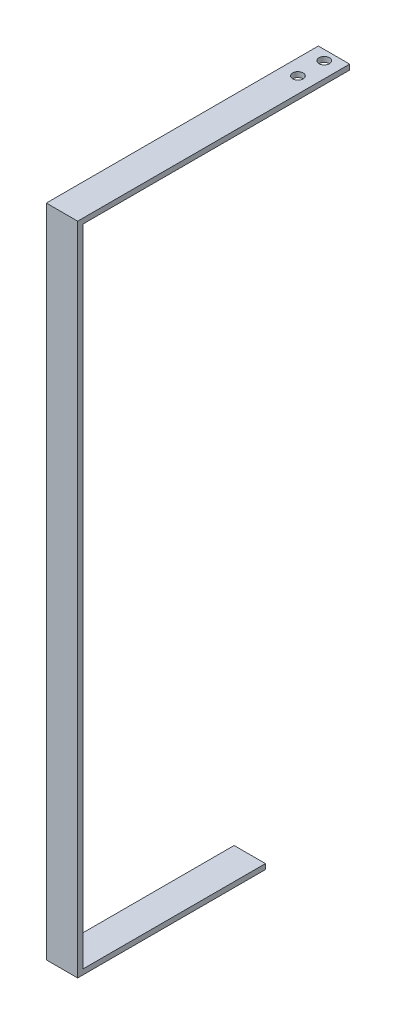
ISO-10303-21;
HEADER;
FILE_DESCRIPTION(('STEP AP214'),'2;1');
FILE_NAME('part.step','',(''),(''),'','','');
FILE_SCHEMA(('AUTOMOTIVE_DESIGN { 1 0 10303 214 1 1 1 1 }'));
ENDSEC;
DATA;
#1=APPLICATION_CONTEXT('core data for automotive mechanical design processes');
#2=APPLICATION_PROTOCOL_DEFINITION('international standard','automotive_design',2000,#1);
#3=PRODUCT_CONTEXT('',#1,'mechanical');
#4=PRODUCT('Part','Part','',(#3));
#5=PRODUCT_RELATED_PRODUCT_CATEGORY('part','',(#4));
#6=PRODUCT_DEFINITION_FORMATION('','',#4);
#7=PRODUCT_DEFINITION_CONTEXT('part definition',#1,'design');
#8=PRODUCT_DEFINITION('design','',#6,#7);
#9=PRODUCT_DEFINITION_SHAPE('','',#8);
#10=(LENGTH_UNIT() NAMED_UNIT(*) SI_UNIT(.MILLI.,.METRE.));
#11=(NAMED_UNIT(*) PLANE_ANGLE_UNIT() SI_UNIT($,.RADIAN.));
#12=(NAMED_UNIT(*) SI_UNIT($,.STERADIAN.) SOLID_ANGLE_UNIT());
#13=UNCERTAINTY_MEASURE_WITH_UNIT(LENGTH_MEASURE(1.E-05),#10,'distance_accuracy_value','');
#14=(GEOMETRIC_REPRESENTATION_CONTEXT(3) GLOBAL_UNCERTAINTY_ASSIGNED_CONTEXT((#13)) GLOBAL_UNIT_ASSIGNED_CONTEXT((#10,
#11,#12)) REPRESENTATION_CONTEXT('',''));
#15=CARTESIAN_POINT('',(0.,0.,0.));
#16=DIRECTION('',(0.,0.,1.));
#17=DIRECTION('',(1.,0.,0.));
#18=AXIS2_PLACEMENT_3D('',#15,#16,#17);
#19=CARTESIAN_POINT('',(19.0499999999999,793.705,222.));
#20=DIRECTION('',(0.,0.,1.));
#21=DIRECTION('',(1.,0.,0.));
#22=AXIS2_PLACEMENT_3D('',#19,#20,#21);
#23=PLANE('',#22);
#24=DIRECTION('',(-1.,0.,0.));
#25=VECTOR('',#24,1.);
#26=CARTESIAN_POINT('',(-19.0500000000001,787.395,222.));
#27=LINE('',#26,#25);
#28=CARTESIAN_POINT('',(19.0499999999999,787.395,222.));
#29=VERTEX_POINT('',#28);
#30=CARTESIAN_POINT('',(-19.0500000000001,787.395,222.));
#31=VERTEX_POINT('',#30);
#32=EDGE_CURVE('E165',#29,#31,#27,.T.);
#33=ORIENTED_EDGE('',*,*,#32,.F.);
#34=DIRECTION('',(0.,-1.,0.));
#35=VECTOR('',#34,1.);
#36=CARTESIAN_POINT('',(19.0499999999999,793.705,222.));
#37=LINE('',#36,#35);
#38=CARTESIAN_POINT('',(19.05,3.155,222.));
#39=VERTEX_POINT('',#38);
#40=EDGE_CURVE('E51',#29,#39,#37,.T.);
#41=ORIENTED_EDGE('',*,*,#40,.T.);
#42=DIRECTION('',(-1.,0.,0.));
#43=VECTOR('',#42,1.);
#44=CARTESIAN_POINT('',(19.05,3.155,222.));
#45=LINE('',#44,#43);
#46=CARTESIAN_POINT('',(-19.05,3.155,222.));
#47=VERTEX_POINT('',#46);
#48=EDGE_CURVE('E141',#39,#47,#45,.T.);
#49=ORIENTED_EDGE('',*,*,#48,.T.);
#50=DIRECTION('',(0.,-1.,0.));
#51=VECTOR('',#50,1.);
#52=CARTESIAN_POINT('',(-19.0500000000001,793.705,222.));
#53=LINE('',#52,#51);
#54=EDGE_CURVE('E88',#31,#47,#53,.T.);
#55=ORIENTED_EDGE('',*,*,#54,.F.);
#56=EDGE_LOOP('',(#33,#41,#49,#55));
#57=FACE_BOUND('',#56,.T.);
#58=ADVANCED_FACE('F36',(#57),#23,.F.);
#59=CARTESIAN_POINT('',(19.05,3.155,228.31));
#60=DIRECTION('',(0.,-1.,0.));
#61=DIRECTION('',(1.,0.,0.));
#62=AXIS2_PLACEMENT_3D('',#59,#60,#61);
#63=PLANE('',#62);
#64=ORIENTED_EDGE('',*,*,#48,.F.);
#65=DIRECTION('',(0.,0.,-1.));
#66=VECTOR('',#65,1.);
#67=CARTESIAN_POINT('',(19.05,3.155,228.31));
#68=LINE('',#67,#66);
#69=CARTESIAN_POINT('',(19.05,3.155,0.));
#70=VERTEX_POINT('',#69);
#71=EDGE_CURVE('E90',#39,#70,#68,.T.);
#72=ORIENTED_EDGE('',*,*,#71,.T.);
#73=DIRECTION('',(-1.,0.,0.));
#74=VECTOR('',#73,1.);
#75=CARTESIAN_POINT('',(19.05,3.155,0.));
#76=LINE('',#75,#74);
#77=CARTESIAN_POINT('',(-19.05,3.155,0.));
#78=VERTEX_POINT('',#77);
#79=EDGE_CURVE('E94',#70,#78,#76,.T.);
#80=ORIENTED_EDGE('',*,*,#79,.T.);
#81=DIRECTION('',(0.,0.,-1.));
#82=VECTOR('',#81,1.);
#83=CARTESIAN_POINT('',(-19.05,3.155,228.31));
#84=LINE('',#83,#82);
#85=EDGE_CURVE('E80',#47,#78,#84,.T.);
#86=ORIENTED_EDGE('',*,*,#85,.F.);
#87=EDGE_LOOP('',(#64,#72,#80,#86));
#88=FACE_BOUND('',#87,.T.);
#89=ADVANCED_FACE('F95',(#88),#63,.F.);
#90=CARTESIAN_POINT('',(-19.05,-3.155,228.31));
#91=DIRECTION('',(1.,0.,0.));
#92=DIRECTION('',(0.,0.,-1.));
#93=AXIS2_PLACEMENT_3D('',#90,#91,#92);
#94=PLANE('',#93);
#95=DIRECTION('',(0.,-1.,0.));
#96=VECTOR('',#95,1.);
#97=CARTESIAN_POINT('',(-19.05,-3.155,0.));
#98=LINE('',#97,#96);
#99=CARTESIAN_POINT('',(-19.05,-3.155,0.));
#100=VERTEX_POINT('',#99);
#101=EDGE_CURVE('E84',#78,#100,#98,.T.);
#102=ORIENTED_EDGE('',*,*,#101,.T.);
#103=DIRECTION('',(0.,0.,-1.));
#104=VECTOR('',#103,1.);
#105=CARTESIAN_POINT('',(-19.05,-3.155,228.31));
#106=LINE('',#105,#104);
#107=CARTESIAN_POINT('',(-19.05,-3.155,228.31));
#108=VERTEX_POINT('',#107);
#109=EDGE_CURVE('E11',#108,#100,#106,.T.);
#110=ORIENTED_EDGE('',*,*,#109,.F.);
#111=DIRECTION('',(0.,-1.,0.));
#112=VECTOR('',#111,1.);
#113=CARTESIAN_POINT('',(-19.05,-3.155,228.31));
#114=LINE('',#113,#112);
#115=CARTESIAN_POINT('',(-19.0500000000001,793.705,228.31));
#116=VERTEX_POINT('',#115);
#117=EDGE_CURVE('E100',#116,#108,#114,.T.);
#118=ORIENTED_EDGE('',*,*,#117,.F.);
#119=DIRECTION('',(0.,0.,1.));
#120=VECTOR('',#119,1.);
#121=CARTESIAN_POINT('',(-19.0500000000001,793.705,222.));
#122=LINE('',#121,#120);
#123=CARTESIAN_POINT('',(-19.0500000000001,793.705,-102.39));
#124=VERTEX_POINT('',#123);
#125=EDGE_CURVE('E126',#124,#116,#122,.T.);
#126=ORIENTED_EDGE('',*,*,#125,.F.);
#127=DIRECTION('',(0.,1.,0.));
#128=VECTOR('',#127,1.);
#129=CARTESIAN_POINT('',(-19.0500000000001,793.705,-102.39));
#130=LINE('',#129,#128);
#131=CARTESIAN_POINT('',(-19.0500000000001,787.395,-102.39));
#132=VERTEX_POINT('',#131);
#133=EDGE_CURVE('E164',#132,#124,#130,.T.);
#134=ORIENTED_EDGE('',*,*,#133,.F.);
#135=DIRECTION('',(0.,0.,1.));
#136=VECTOR('',#135,1.);
#137=CARTESIAN_POINT('',(-19.0500000000001,787.395,-102.39));
#138=LINE('',#137,#136);
#139=EDGE_CURVE('E175',#132,#31,#138,.T.);
#140=ORIENTED_EDGE('',*,*,#139,.T.);
#141=ORIENTED_EDGE('',*,*,#54,.T.);
#142=ORIENTED_EDGE('',*,*,#85,.T.);
#143=EDGE_LOOP('',(#102,#110,#118,#126,#134,#140,#141,#142));
#144=FACE_BOUND('',#143,.T.);
#145=ADVANCED_FACE('F38',(#144),#94,.F.);
#146=CARTESIAN_POINT('',(19.05,-3.155,228.31));
#147=DIRECTION('',(0.,1.,0.));
#148=DIRECTION('',(-1.,0.,0.));
#149=AXIS2_PLACEMENT_3D('',#146,#147,#148);
#150=PLANE('',#149);
#151=DIRECTION('',(1.,0.,0.));
#152=VECTOR('',#151,1.);
#153=CARTESIAN_POINT('',(19.05,-3.155,0.));
#154=LINE('',#153,#152);
#155=CARTESIAN_POINT('',(19.05,-3.155,0.));
#156=VERTEX_POINT('',#155);
#157=EDGE_CURVE('E104',#100,#156,#154,.T.);
#158=ORIENTED_EDGE('',*,*,#157,.T.);
#159=DIRECTION('',(0.,0.,-1.));
#160=VECTOR('',#159,1.);
#161=CARTESIAN_POINT('',(19.05,-3.155,228.31));
#162=LINE('',#161,#160);
#163=CARTESIAN_POINT('',(19.05,-3.155,228.31));
#164=VERTEX_POINT('',#163);
#165=EDGE_CURVE('E44',#164,#156,#162,.T.);
#166=ORIENTED_EDGE('',*,*,#165,.F.);
#167=DIRECTION('',(1.,0.,0.));
#168=VECTOR('',#167,1.);
#169=CARTESIAN_POINT('',(19.05,-3.155,228.31));
#170=LINE('',#169,#168);
#171=EDGE_CURVE('E60',#108,#164,#170,.T.);
#172=ORIENTED_EDGE('',*,*,#171,.F.);
#173=ORIENTED_EDGE('',*,*,#109,.T.);
#174=EDGE_LOOP('',(#158,#166,#172,#173));
#175=FACE_BOUND('',#174,.T.);
#176=ADVANCED_FACE('F118',(#175),#150,.F.);
#177=CARTESIAN_POINT('',(19.05,-3.155,228.31));
#178=DIRECTION('',(-1.,0.,0.));
#179=DIRECTION('',(0.,0.,1.));
#180=AXIS2_PLACEMENT_3D('',#177,#178,#179);
#181=PLANE('',#180);
#182=DIRECTION('',(0.,1.,0.));
#183=VECTOR('',#182,1.);
#184=CARTESIAN_POINT('',(19.05,-3.155,0.));
#185=LINE('',#184,#183);
#186=EDGE_CURVE('E101',#156,#70,#185,.T.);
#187=ORIENTED_EDGE('',*,*,#186,.T.);
#188=ORIENTED_EDGE('',*,*,#71,.F.);
#189=ORIENTED_EDGE('',*,*,#40,.F.);
#190=DIRECTION('',(0.,0.,1.));
#191=VECTOR('',#190,1.);
#192=CARTESIAN_POINT('',(19.0499999999999,787.395,-102.39));
#193=LINE('',#192,#191);
#194=CARTESIAN_POINT('',(19.0499999999999,787.395,-102.39));
#195=VERTEX_POINT('',#194);
#196=EDGE_CURVE('E143',#195,#29,#193,.T.);
#197=ORIENTED_EDGE('',*,*,#196,.F.);
#198=DIRECTION('',(0.,-1.,0.));
#199=VECTOR('',#198,1.);
#200=CARTESIAN_POINT('',(19.0499999999999,787.395,-102.39));
#201=LINE('',#200,#199);
#202=CARTESIAN_POINT('',(19.0499999999999,793.705,-102.39));
#203=VERTEX_POINT('',#202);
#204=EDGE_CURVE('E156',#203,#195,#201,.T.);
#205=ORIENTED_EDGE('',*,*,#204,.F.);
#206=DIRECTION('',(0.,0.,-1.));
#207=VECTOR('',#206,1.);
#208=CARTESIAN_POINT('',(19.0499999999999,793.705,228.31));
#209=LINE('',#208,#207);
#210=CARTESIAN_POINT('',(19.0499999999999,793.705,228.31));
#211=VERTEX_POINT('',#210);
#212=EDGE_CURVE('E135',#211,#203,#209,.T.);
#213=ORIENTED_EDGE('',*,*,#212,.F.);
#214=DIRECTION('',(0.,1.,0.));
#215=VECTOR('',#214,1.);
#216=CARTESIAN_POINT('',(19.05,-3.155,228.31));
#217=LINE('',#216,#215);
#218=EDGE_CURVE('E91',#164,#211,#217,.T.);
#219=ORIENTED_EDGE('',*,*,#218,.F.);
#220=ORIENTED_EDGE('',*,*,#165,.T.);
#221=EDGE_LOOP('',(#187,#188,#189,#197,#205,#213,#219,#220));
#222=FACE_BOUND('',#221,.T.);
#223=ADVANCED_FACE('F115',(#222),#181,.F.);
#224=CARTESIAN_POINT('',(0.,0.,228.31));
#225=DIRECTION('',(0.,0.,1.));
#226=DIRECTION('',(1.,0.,0.));
#227=AXIS2_PLACEMENT_3D('',#224,#225,#226);
#228=PLANE('',#227);
#229=ORIENTED_EDGE('',*,*,#117,.T.);
#230=ORIENTED_EDGE('',*,*,#171,.T.);
#231=ORIENTED_EDGE('',*,*,#218,.T.);
#232=DIRECTION('',(1.,0.,0.));
#233=VECTOR('',#232,1.);
#234=CARTESIAN_POINT('',(-19.0500000000001,793.705,228.31));
#235=LINE('',#234,#233);
#236=EDGE_CURVE('E131',#116,#211,#235,.T.);
#237=ORIENTED_EDGE('',*,*,#236,.F.);
#238=EDGE_LOOP('',(#229,#230,#231,#237));
#239=FACE_BOUND('',#238,.T.);
#240=ADVANCED_FACE('F132',(#239),#228,.T.);
#241=CARTESIAN_POINT('',(0.,0.,0.));
#242=DIRECTION('',(0.,0.,1.));
#243=DIRECTION('',(1.,0.,0.));
#244=AXIS2_PLACEMENT_3D('',#241,#242,#243);
#245=PLANE('',#244);
#246=ORIENTED_EDGE('',*,*,#101,.F.);
#247=ORIENTED_EDGE('',*,*,#79,.F.);
#248=ORIENTED_EDGE('',*,*,#186,.F.);
#249=ORIENTED_EDGE('',*,*,#157,.F.);
#250=EDGE_LOOP('',(#246,#247,#248,#249));
#251=FACE_BOUND('',#250,.T.);
#252=ADVANCED_FACE('F103',(#251),#245,.F.);
#253=CARTESIAN_POINT('',(-1.08414070590565E-13,793.705,0.));
#254=DIRECTION('',(0.,1.,0.));
#255=DIRECTION('',(-1.,0.,0.));
#256=AXIS2_PLACEMENT_3D('',#253,#254,#255);
#257=PLANE('',#256);
#258=CARTESIAN_POINT('',(5.16514529637893E-12,793.705,-58.4977953342767));
#259=DIRECTION('',(0.,1.,0.));
#260=DIRECTION('',(-1.,0.,0.));
#261=AXIS2_PLACEMENT_3D('',#258,#259,#260);
#262=CIRCLE('',#261,6.34999999999991);
#263=CARTESIAN_POINT('',(-6.34999999999475,793.705,-58.4977953342767));
#264=VERTEX_POINT('',#263);
#265=EDGE_CURVE('E298',#264,#264,#262,.T.);
#266=ORIENTED_EDGE('',*,*,#265,.F.);
#267=EDGE_LOOP('',(#266));
#268=FACE_BOUND('',#267,.T.);
#269=CARTESIAN_POINT('',(5.27616759884144E-12,793.705,-90.4977953342767));
#270=DIRECTION('',(0.,1.,0.));
#271=DIRECTION('',(-1.,0.,0.));
#272=AXIS2_PLACEMENT_3D('',#269,#270,#271);
#273=CIRCLE('',#272,6.35000000000002);
#274=CARTESIAN_POINT('',(-6.34999999999475,793.705,-90.4977953342767));
#275=VERTEX_POINT('',#274);
#276=EDGE_CURVE('E171',#275,#275,#273,.T.);
#277=ORIENTED_EDGE('',*,*,#276,.F.);
#278=EDGE_LOOP('',(#277));
#279=FACE_BOUND('',#278,.T.);
#280=ORIENTED_EDGE('',*,*,#125,.T.);
#281=ORIENTED_EDGE('',*,*,#236,.T.);
#282=ORIENTED_EDGE('',*,*,#212,.T.);
#283=DIRECTION('',(1.,0.,0.));
#284=VECTOR('',#283,1.);
#285=CARTESIAN_POINT('',(19.0499999999999,793.705,-102.39));
#286=LINE('',#285,#284);
#287=EDGE_CURVE('E140',#124,#203,#286,.T.);
#288=ORIENTED_EDGE('',*,*,#287,.F.);
#289=EDGE_LOOP('',(#280,#281,#282,#288));
#290=FACE_BOUND('',#289,.T.);
#291=ADVANCED_FACE('F138',(#268,#279,#290),#257,.T.);
#292=CARTESIAN_POINT('',(-19.0500000000001,787.395,-102.39));
#293=DIRECTION('',(0.,1.,0.));
#294=DIRECTION('',(0.,0.,1.));
#295=AXIS2_PLACEMENT_3D('',#292,#293,#294);
#296=PLANE('',#295);
#297=CARTESIAN_POINT('',(5.16600719442093E-12,787.395,-58.4977953342767));
#298=DIRECTION('',(0.,1.,0.));
#299=DIRECTION('',(-1.,0.,0.));
#300=AXIS2_PLACEMENT_3D('',#297,#298,#299);
#301=CIRCLE('',#300,6.34999999999991);
#302=CARTESIAN_POINT('',(-6.34999999999474,787.395,-58.4977953342767));
#303=VERTEX_POINT('',#302);
#304=EDGE_CURVE('E295',#303,#303,#301,.T.);
#305=ORIENTED_EDGE('',*,*,#304,.T.);
#306=EDGE_LOOP('',(#305));
#307=FACE_BOUND('',#306,.T.);
#308=CARTESIAN_POINT('',(5.27702949688345E-12,787.395,-90.4977953342767));
#309=DIRECTION('',(0.,1.,0.));
#310=DIRECTION('',(-1.,0.,0.));
#311=AXIS2_PLACEMENT_3D('',#308,#309,#310);
#312=CIRCLE('',#311,6.35000000000002);
#313=CARTESIAN_POINT('',(-6.34999999999474,787.395,-90.4977953342767));
#314=VERTEX_POINT('',#313);
#315=EDGE_CURVE('E168',#314,#314,#312,.T.);
#316=ORIENTED_EDGE('',*,*,#315,.T.);
#317=EDGE_LOOP('',(#316));
#318=FACE_BOUND('',#317,.T.);
#319=ORIENTED_EDGE('',*,*,#32,.T.);
#320=ORIENTED_EDGE('',*,*,#139,.F.);
#321=DIRECTION('',(-1.,0.,0.));
#322=VECTOR('',#321,1.);
#323=CARTESIAN_POINT('',(-19.0500000000001,787.395,-102.39));
#324=LINE('',#323,#322);
#325=EDGE_CURVE('E161',#195,#132,#324,.T.);
#326=ORIENTED_EDGE('',*,*,#325,.F.);
#327=ORIENTED_EDGE('',*,*,#196,.T.);
#328=EDGE_LOOP('',(#319,#320,#326,#327));
#329=FACE_BOUND('',#328,.T.);
#330=ADVANCED_FACE('F179',(#307,#318,#329),#296,.F.);
#331=CARTESIAN_POINT('',(0.,0.,-102.39));
#332=DIRECTION('',(0.,0.,1.));
#333=DIRECTION('',(1.,0.,0.));
#334=AXIS2_PLACEMENT_3D('',#331,#332,#333);
#335=PLANE('',#334);
#336=ORIENTED_EDGE('',*,*,#287,.T.);
#337=ORIENTED_EDGE('',*,*,#204,.T.);
#338=ORIENTED_EDGE('',*,*,#325,.T.);
#339=ORIENTED_EDGE('',*,*,#133,.T.);
#340=EDGE_LOOP('',(#336,#337,#338,#339));
#341=FACE_BOUND('',#340,.T.);
#342=ADVANCED_FACE('F163',(#341),#335,.F.);
#343=CARTESIAN_POINT('',(5.27702949688345E-12,787.395,-90.4977953342767));
#344=DIRECTION('',(0.,1.,0.));
#345=DIRECTION('',(-1.,0.,0.));
#346=AXIS2_PLACEMENT_3D('',#343,#344,#345);
#347=CYLINDRICAL_SURFACE('',#346,6.35000000000002);
#348=ORIENTED_EDGE('',*,*,#315,.F.);
#349=EDGE_LOOP('',(#348));
#350=FACE_BOUND('',#349,.T.);
#351=ORIENTED_EDGE('',*,*,#276,.T.);
#352=EDGE_LOOP('',(#351));
#353=FACE_BOUND('',#352,.T.);
#354=ADVANCED_FACE('F268',(#350,#353),#347,.F.);
#355=CARTESIAN_POINT('',(5.16600719442093E-12,787.395,-58.4977953342767));
#356=DIRECTION('',(0.,1.,0.));
#357=DIRECTION('',(-1.,0.,0.));
#358=AXIS2_PLACEMENT_3D('',#355,#356,#357);
#359=CYLINDRICAL_SURFACE('',#358,6.34999999999991);
#360=ORIENTED_EDGE('',*,*,#304,.F.);
#361=EDGE_LOOP('',(#360));
#362=FACE_BOUND('',#361,.T.);
#363=ORIENTED_EDGE('',*,*,#265,.T.);
#364=EDGE_LOOP('',(#363));
#365=FACE_BOUND('',#364,.T.);
#366=ADVANCED_FACE('F275',(#362,#365),#359,.F.);
#367=CLOSED_SHELL('',(#58,#89,#145,#176,#223,#240,#252,#291,#330,#342,#354,#366));
#368=MANIFOLD_SOLID_BREP('B2',#367);
#369=ADVANCED_BREP_SHAPE_REPRESENTATION('',(#18,#368),#14);
#370=SHAPE_DEFINITION_REPRESENTATION(#9,#369);
ENDSEC;
END-ISO-10303-21;
